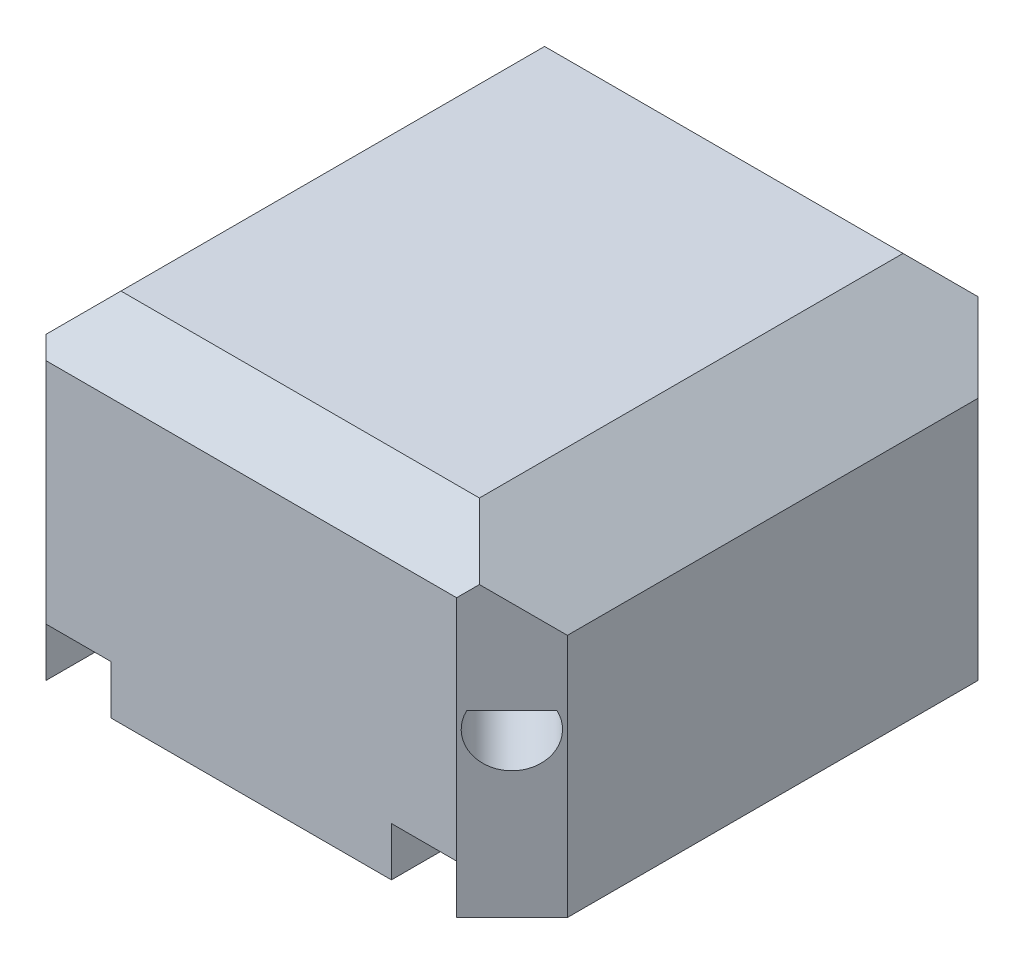
ISO-10303-21;
HEADER;
FILE_DESCRIPTION(('STEP AP214'),'2;1');
FILE_NAME('part.step','',(''),(''),'','','');
FILE_SCHEMA(('AUTOMOTIVE_DESIGN { 1 0 10303 214 1 1 1 1 }'));
ENDSEC;
DATA;
#1=APPLICATION_CONTEXT('core data for automotive mechanical design processes');
#2=APPLICATION_PROTOCOL_DEFINITION('international standard','automotive_design',2000,#1);
#3=PRODUCT_CONTEXT('',#1,'mechanical');
#4=PRODUCT('Part','Part','',(#3));
#5=PRODUCT_RELATED_PRODUCT_CATEGORY('part','',(#4));
#6=PRODUCT_DEFINITION_FORMATION('','',#4);
#7=PRODUCT_DEFINITION_CONTEXT('part definition',#1,'design');
#8=PRODUCT_DEFINITION('design','',#6,#7);
#9=PRODUCT_DEFINITION_SHAPE('','',#8);
#10=(LENGTH_UNIT() NAMED_UNIT(*) SI_UNIT(.MILLI.,.METRE.));
#11=(NAMED_UNIT(*) PLANE_ANGLE_UNIT() SI_UNIT($,.RADIAN.));
#12=(NAMED_UNIT(*) SI_UNIT($,.STERADIAN.) SOLID_ANGLE_UNIT());
#13=UNCERTAINTY_MEASURE_WITH_UNIT(LENGTH_MEASURE(1.E-05),#10,'distance_accuracy_value','');
#14=(GEOMETRIC_REPRESENTATION_CONTEXT(3) GLOBAL_UNCERTAINTY_ASSIGNED_CONTEXT((#13)) GLOBAL_UNIT_ASSIGNED_CONTEXT((#10,
#11,#12)) REPRESENTATION_CONTEXT('',''));
#15=CARTESIAN_POINT('',(0.,0.,0.));
#16=DIRECTION('',(0.,0.,1.));
#17=DIRECTION('',(1.,0.,0.));
#18=AXIS2_PLACEMENT_3D('',#15,#16,#17);
#19=CARTESIAN_POINT('',(-15.3430605110506,100.,66.928681339993));
#20=DIRECTION('',(-0.707106781186546,0.,-0.707106781186549));
#21=DIRECTION('',(0.,-1.,0.));
#22=AXIS2_PLACEMENT_3D('',#19,#20,#21);
#23=PLANE('',#22);
#24=DIRECTION('',(-0.577350269189627,0.577350269189625,0.577350269189625));
#25=VECTOR('',#24,1.);
#26=CARTESIAN_POINT('',(-9.70016673105307,69.3571062200024,61.2857875599954));
#27=LINE('',#26,#25);
#28=CARTESIAN_POINT('',(-28.8430605110507,88.4999999999999,80.428681339993));
#29=VERTEX_POINT('',#28);
#30=CARTESIAN_POINT('',(-15.3430605110506,75.,66.928681339993));
#31=VERTEX_POINT('',#30);
#32=EDGE_CURVE('E374',#29,#31,#27,.F.);
#33=ORIENTED_EDGE('',*,*,#32,.F.);
#34=DIRECTION('',(0.577350269189626,0.577350269189627,-0.577350269189624));
#35=VECTOR('',#34,1.);
#36=CARTESIAN_POINT('',(-16.0097271777173,101.333333333333,67.5953480066596));
#37=LINE('',#36,#35);
#38=CARTESIAN_POINT('',(-32.3430605110507,84.9999999999999,83.928681339993));
#39=VERTEX_POINT('',#38);
#40=EDGE_CURVE('E409',#29,#39,#37,.F.);
#41=ORIENTED_EDGE('',*,*,#40,.T.);
#42=DIRECTION('',(0.,1.,0.));
#43=VECTOR('',#42,1.);
#44=CARTESIAN_POINT('',(-32.3430605110507,100.,83.928681339993));
#45=LINE('',#44,#43);
#46=CARTESIAN_POINT('',(-32.3430605110507,15.,83.928681339993));
#47=VERTEX_POINT('',#46);
#48=EDGE_CURVE('E384',#47,#39,#45,.T.);
#49=ORIENTED_EDGE('',*,*,#48,.F.);
#50=CARTESIAN_POINT('',(-32.3430605110507,0.,83.928681339993));
#51=VERTEX_POINT('',#50);
#52=EDGE_CURVE('E381',#51,#47,#45,.T.);
#53=ORIENTED_EDGE('',*,*,#52,.F.);
#54=DIRECTION('',(0.707106781186549,0.,-0.707106781186546));
#55=VECTOR('',#54,1.);
#56=CARTESIAN_POINT('',(-15.3430605110506,0.,66.928681339993));
#57=LINE('',#56,#55);
#58=CARTESIAN_POINT('',(-15.3430605110506,0.,66.928681339993));
#59=VERTEX_POINT('',#58);
#60=EDGE_CURVE('E362',#59,#51,#57,.F.);
#61=ORIENTED_EDGE('',*,*,#60,.F.);
#62=DIRECTION('',(0.,-1.,0.));
#63=VECTOR('',#62,1.);
#64=CARTESIAN_POINT('',(-15.3430605110506,100.,66.928681339993));
#65=LINE('',#64,#63);
#66=EDGE_CURVE('E369',#31,#59,#65,.T.);
#67=ORIENTED_EDGE('',*,*,#66,.F.);
#68=EDGE_LOOP('',(#33,#41,#49,#53,#61,#67));
#69=FACE_BOUND('',#68,.T.);
#70=DIRECTION('',(0.707106781186547,0.,-0.707106781186548));
#71=VECTOR('',#70,1.);
#72=CARTESIAN_POINT('',(21.8641290744781,55.,29.7214917544641));
#73=LINE('',#72,#71);
#74=CARTESIAN_POINT('',(-30.7925925195198,55.,82.3782133484621));
#75=VERTEX_POINT('',#74);
#76=CARTESIAN_POINT('',(-16.9361860589688,55.,68.5218068879111));
#77=VERTEX_POINT('',#76);
#78=EDGE_CURVE('E245',#75,#77,#73,.T.);
#79=ORIENTED_EDGE('',*,*,#78,.T.);
#80=CARTESIAN_POINT('',(-23.8643892892443,50.,75.4500101181866));
#81=DIRECTION('',(-0.707106781186548,0.,-0.707106781186547));
#82=DIRECTION('',(-0.707106781186547,0.,0.707106781186548));
#83=AXIS2_PLACEMENT_3D('',#80,#81,#82);
#84=CIRCLE('',#83,11.);
#85=EDGE_CURVE('E70',#77,#75,#84,.T.);
#86=ORIENTED_EDGE('',*,*,#85,.T.);
#87=EDGE_LOOP('',(#79,#86));
#88=FACE_BOUND('',#87,.T.);
#89=ADVANCED_FACE('F43',(#69,#88),#23,.F.);
#90=CARTESIAN_POINT('',(-175.343060511051,100.,-59.071318660007));
#91=DIRECTION('',(0.707106781186546,0.,0.707106781186549));
#92=DIRECTION('',(0.,-1.,0.));
#93=AXIS2_PLACEMENT_3D('',#90,#91,#92);
#94=PLANE('',#93);
#95=DIRECTION('',(0.577350269189627,0.577350269189626,-0.577350269189625));
#96=VECTOR('',#95,1.);
#97=CARTESIAN_POINT('',(-178.36683339772,71.976227113331,-56.0475457733381));
#98=LINE('',#97,#96);
#99=CARTESIAN_POINT('',(-161.843060511051,88.4999999999999,-72.571318660007));
#100=VERTEX_POINT('',#99);
#101=CARTESIAN_POINT('',(-175.343060511051,75.,-59.071318660007));
#102=VERTEX_POINT('',#101);
#103=EDGE_CURVE('E394',#100,#102,#98,.F.);
#104=ORIENTED_EDGE('',*,*,#103,.F.);
#105=DIRECTION('',(-0.577350269189626,0.577350269189627,0.577350269189625));
#106=VECTOR('',#105,1.);
#107=CARTESIAN_POINT('',(-174.676393844384,101.333333333333,-59.7379853266737));
#108=LINE('',#107,#106);
#109=CARTESIAN_POINT('',(-158.343060511051,84.9999999999999,-76.071318660007));
#110=VERTEX_POINT('',#109);
#111=EDGE_CURVE('E420',#100,#110,#108,.F.);
#112=ORIENTED_EDGE('',*,*,#111,.T.);
#113=DIRECTION('',(0.,1.,0.));
#114=VECTOR('',#113,1.);
#115=CARTESIAN_POINT('',(-158.343060511051,100.,-76.071318660007));
#116=LINE('',#115,#114);
#117=CARTESIAN_POINT('',(-158.343060511051,15.,-76.071318660007));
#118=VERTEX_POINT('',#117);
#119=EDGE_CURVE('E351',#118,#110,#116,.T.);
#120=ORIENTED_EDGE('',*,*,#119,.F.);
#121=CARTESIAN_POINT('',(-158.343060511051,0.,-76.071318660007));
#122=VERTEX_POINT('',#121);
#123=EDGE_CURVE('E353',#122,#118,#116,.T.);
#124=ORIENTED_EDGE('',*,*,#123,.F.);
#125=DIRECTION('',(-0.707106781186549,0.,0.707106781186546));
#126=VECTOR('',#125,1.);
#127=CARTESIAN_POINT('',(-175.343060511051,0.,-59.071318660007));
#128=LINE('',#127,#126);
#129=CARTESIAN_POINT('',(-175.343060511051,0.,-59.071318660007));
#130=VERTEX_POINT('',#129);
#131=EDGE_CURVE('E365',#130,#122,#128,.F.);
#132=ORIENTED_EDGE('',*,*,#131,.F.);
#133=DIRECTION('',(0.,-1.,0.));
#134=VECTOR('',#133,1.);
#135=CARTESIAN_POINT('',(-175.343060511051,100.,-59.071318660007));
#136=LINE('',#135,#134);
#137=EDGE_CURVE('E390',#102,#130,#136,.T.);
#138=ORIENTED_EDGE('',*,*,#137,.F.);
#139=EDGE_LOOP('',(#104,#112,#120,#124,#132,#138));
#140=FACE_BOUND('',#139,.T.);
#141=DIRECTION('',(-0.707106781186547,0.,0.707106781186548));
#142=VECTOR('',#141,1.);
#143=CARTESIAN_POINT('',(-212.550250096579,55.,-21.8641290744781));
#144=LINE('',#143,#142);
#145=CARTESIAN_POINT('',(-159.893528502582,55.,-74.5208506684761));
#146=VERTEX_POINT('',#145);
#147=CARTESIAN_POINT('',(-173.749934963133,55.,-60.6644442079252));
#148=VERTEX_POINT('',#147);
#149=EDGE_CURVE('E259',#146,#148,#144,.T.);
#150=ORIENTED_EDGE('',*,*,#149,.T.);
#151=CARTESIAN_POINT('',(-166.821731732857,50.,-67.5926474382006));
#152=DIRECTION('',(0.707106781186548,0.,0.707106781186547));
#153=DIRECTION('',(0.707106781186547,0.,-0.707106781186548));
#154=AXIS2_PLACEMENT_3D('',#151,#152,#153);
#155=CIRCLE('',#154,11.);
#156=EDGE_CURVE('E249',#148,#146,#155,.T.);
#157=ORIENTED_EDGE('',*,*,#156,.T.);
#158=EDGE_LOOP('',(#150,#157));
#159=FACE_BOUND('',#158,.T.);
#160=ADVANCED_FACE('F499',(#140,#159),#94,.F.);
#161=CARTESIAN_POINT('',(-175.343060511051,100.,83.928681339993));
#162=DIRECTION('',(0.,0.,-1.));
#163=DIRECTION('',(-1.,0.,0.));
#164=AXIS2_PLACEMENT_3D('',#161,#162,#163);
#165=PLANE('',#164);
#166=DIRECTION('',(-1.,0.,0.));
#167=VECTOR('',#166,1.);
#168=CARTESIAN_POINT('',(-158.343060511051,15.,83.928681339993));
#169=LINE('',#168,#167);
#170=CARTESIAN_POINT('',(-138.343060511051,15.,83.928681339993));
#171=VERTEX_POINT('',#170);
#172=CARTESIAN_POINT('',(-158.343060511051,15.,83.928681339993));
#173=VERTEX_POINT('',#172);
#174=EDGE_CURVE('E278',#171,#173,#169,.T.);
#175=ORIENTED_EDGE('',*,*,#174,.F.);
#176=DIRECTION('',(0.,-1.,0.));
#177=VECTOR('',#176,1.);
#178=CARTESIAN_POINT('',(-138.343060511051,15.,83.928681339993));
#179=LINE('',#178,#177);
#180=CARTESIAN_POINT('',(-138.343060511051,0.,83.928681339993));
#181=VERTEX_POINT('',#180);
#182=EDGE_CURVE('E288',#171,#181,#179,.T.);
#183=ORIENTED_EDGE('',*,*,#182,.T.);
#184=DIRECTION('',(1.,0.,0.));
#185=VECTOR('',#184,1.);
#186=CARTESIAN_POINT('',(-175.343060511051,0.,83.928681339993));
#187=LINE('',#186,#185);
#188=CARTESIAN_POINT('',(-52.3430605110506,0.,83.928681339993));
#189=VERTEX_POINT('',#188);
#190=EDGE_CURVE('E334',#181,#189,#187,.T.);
#191=ORIENTED_EDGE('',*,*,#190,.T.);
#192=DIRECTION('',(0.,-1.,0.));
#193=VECTOR('',#192,1.);
#194=CARTESIAN_POINT('',(-52.3430605110507,15.,83.928681339993));
#195=LINE('',#194,#193);
#196=CARTESIAN_POINT('',(-52.3430605110507,15.,83.928681339993));
#197=VERTEX_POINT('',#196);
#198=EDGE_CURVE('E295',#197,#189,#195,.T.);
#199=ORIENTED_EDGE('',*,*,#198,.F.);
#200=DIRECTION('',(-1.,0.,0.));
#201=VECTOR('',#200,1.);
#202=CARTESIAN_POINT('',(-32.3430605110507,15.,83.928681339993));
#203=LINE('',#202,#201);
#204=EDGE_CURVE('E309',#47,#197,#203,.T.);
#205=ORIENTED_EDGE('',*,*,#204,.F.);
#206=ORIENTED_EDGE('',*,*,#48,.T.);
#207=DIRECTION('',(-1.,0.,0.));
#208=VECTOR('',#207,1.);
#209=CARTESIAN_POINT('',(-150.343060511051,84.9999999999999,83.928681339993));
#210=LINE('',#209,#208);
#211=CARTESIAN_POINT('',(-158.343060511051,84.9999999999999,83.928681339993));
#212=VERTEX_POINT('',#211);
#213=EDGE_CURVE('E408',#39,#212,#210,.T.);
#214=ORIENTED_EDGE('',*,*,#213,.T.);
#215=DIRECTION('',(0.,-1.,0.));
#216=VECTOR('',#215,1.);
#217=CARTESIAN_POINT('',(-158.343060511051,100.,83.928681339993));
#218=LINE('',#217,#216);
#219=EDGE_CURVE('E379',#212,#173,#218,.T.);
#220=ORIENTED_EDGE('',*,*,#219,.T.);
#221=EDGE_LOOP('',(#175,#183,#191,#199,#205,#206,#214,#220));
#222=FACE_BOUND('',#221,.T.);
#223=ADVANCED_FACE('F476',(#222),#165,.F.);
#224=CARTESIAN_POINT('',(-175.343060511051,100.,-76.071318660007));
#225=DIRECTION('',(0.,0.,1.));
#226=DIRECTION('',(1.,0.,0.));
#227=AXIS2_PLACEMENT_3D('',#224,#225,#226);
#228=PLANE('',#227);
#229=DIRECTION('',(1.,0.,0.));
#230=VECTOR('',#229,1.);
#231=CARTESIAN_POINT('',(-158.343060511051,15.,-76.071318660007));
#232=LINE('',#231,#230);
#233=CARTESIAN_POINT('',(-138.343060511051,15.,-76.071318660007));
#234=VERTEX_POINT('',#233);
#235=EDGE_CURVE('E275',#118,#234,#232,.T.);
#236=ORIENTED_EDGE('',*,*,#235,.F.);
#237=ORIENTED_EDGE('',*,*,#119,.T.);
#238=DIRECTION('',(1.,0.,0.));
#239=VECTOR('',#238,1.);
#240=CARTESIAN_POINT('',(-40.3430605110508,84.9999999999999,-76.071318660007));
#241=LINE('',#240,#239);
#242=CARTESIAN_POINT('',(-32.3430605110507,84.9999999999999,-76.071318660007));
#243=VERTEX_POINT('',#242);
#244=EDGE_CURVE('E55',#110,#243,#241,.T.);
#245=ORIENTED_EDGE('',*,*,#244,.T.);
#246=DIRECTION('',(0.,-1.,0.));
#247=VECTOR('',#246,1.);
#248=CARTESIAN_POINT('',(-32.3430605110507,100.,-76.071318660007));
#249=LINE('',#248,#247);
#250=CARTESIAN_POINT('',(-32.3430605110506,15.,-76.071318660007));
#251=VERTEX_POINT('',#250);
#252=EDGE_CURVE('E357',#243,#251,#249,.T.);
#253=ORIENTED_EDGE('',*,*,#252,.T.);
#254=DIRECTION('',(1.,0.,0.));
#255=VECTOR('',#254,1.);
#256=CARTESIAN_POINT('',(-32.3430605110506,15.,-76.071318660007));
#257=LINE('',#256,#255);
#258=CARTESIAN_POINT('',(-52.3430605110506,15.,-76.071318660007));
#259=VERTEX_POINT('',#258);
#260=EDGE_CURVE('E298',#259,#251,#257,.T.);
#261=ORIENTED_EDGE('',*,*,#260,.F.);
#262=DIRECTION('',(0.,-1.,0.));
#263=VECTOR('',#262,1.);
#264=CARTESIAN_POINT('',(-52.3430605110506,15.,-76.071318660007));
#265=LINE('',#264,#263);
#266=CARTESIAN_POINT('',(-52.3430605110506,0.,-76.071318660007));
#267=VERTEX_POINT('',#266);
#268=EDGE_CURVE('E300',#259,#267,#265,.T.);
#269=ORIENTED_EDGE('',*,*,#268,.T.);
#270=DIRECTION('',(-1.,0.,0.));
#271=VECTOR('',#270,1.);
#272=CARTESIAN_POINT('',(-175.343060511051,0.,-76.071318660007));
#273=LINE('',#272,#271);
#274=CARTESIAN_POINT('',(-138.343060511051,0.,-76.071318660007));
#275=VERTEX_POINT('',#274);
#276=EDGE_CURVE('E339',#267,#275,#273,.T.);
#277=ORIENTED_EDGE('',*,*,#276,.T.);
#278=DIRECTION('',(0.,-1.,0.));
#279=VECTOR('',#278,1.);
#280=CARTESIAN_POINT('',(-138.343060511051,15.,-76.071318660007));
#281=LINE('',#280,#279);
#282=EDGE_CURVE('E285',#234,#275,#281,.T.);
#283=ORIENTED_EDGE('',*,*,#282,.F.);
#284=EDGE_LOOP('',(#236,#237,#245,#253,#261,#269,#277,#283));
#285=FACE_BOUND('',#284,.T.);
#286=ADVANCED_FACE('F421',(#285),#228,.F.);
#287=CARTESIAN_POINT('',(0.,0.,0.));
#288=DIRECTION('',(0.,1.,0.));
#289=DIRECTION('',(0.,0.,1.));
#290=AXIS2_PLACEMENT_3D('',#287,#288,#289);
#291=PLANE('',#290);
#292=DIRECTION('',(0.,0.,-1.));
#293=VECTOR('',#292,1.);
#294=CARTESIAN_POINT('',(-158.343060511051,0.,83.928681339993));
#295=LINE('',#294,#293);
#296=CARTESIAN_POINT('',(-158.343060511051,0.,83.928681339993));
#297=VERTEX_POINT('',#296);
#298=EDGE_CURVE('E283',#297,#122,#295,.T.);
#299=ORIENTED_EDGE('',*,*,#298,.F.);
#300=DIRECTION('',(0.707106781186546,0.,0.707106781186549));
#301=VECTOR('',#300,1.);
#302=CARTESIAN_POINT('',(-158.343060511051,0.,83.928681339993));
#303=LINE('',#302,#301);
#304=CARTESIAN_POINT('',(-175.343060511051,0.,66.9286813399929));
#305=VERTEX_POINT('',#304);
#306=EDGE_CURVE('E359',#297,#305,#303,.F.);
#307=ORIENTED_EDGE('',*,*,#306,.T.);
#308=DIRECTION('',(0.,0.,1.));
#309=VECTOR('',#308,1.);
#310=CARTESIAN_POINT('',(-175.343060511051,0.,-76.071318660007));
#311=LINE('',#310,#309);
#312=EDGE_CURVE('E328',#130,#305,#311,.T.);
#313=ORIENTED_EDGE('',*,*,#312,.F.);
#314=ORIENTED_EDGE('',*,*,#131,.T.);
#315=EDGE_LOOP('',(#299,#307,#313,#314));
#316=FACE_BOUND('',#315,.T.);
#317=ADVANCED_FACE('F494',(#316),#291,.F.);
#318=DIRECTION('',(0.,0.,1.));
#319=VECTOR('',#318,1.);
#320=CARTESIAN_POINT('',(-138.343060511051,0.,83.928681339993));
#321=LINE('',#320,#319);
#322=EDGE_CURVE('E271',#275,#181,#321,.T.);
#323=ORIENTED_EDGE('',*,*,#322,.F.);
#324=ORIENTED_EDGE('',*,*,#276,.F.);
#325=DIRECTION('',(0.,0.,-1.));
#326=VECTOR('',#325,1.);
#327=CARTESIAN_POINT('',(-52.3430605110507,0.,83.928681339993));
#328=LINE('',#327,#326);
#329=EDGE_CURVE('E301',#189,#267,#328,.T.);
#330=ORIENTED_EDGE('',*,*,#329,.F.);
#331=ORIENTED_EDGE('',*,*,#190,.F.);
#332=EDGE_LOOP('',(#323,#324,#330,#331));
#333=FACE_BOUND('',#332,.T.);
#334=ADVANCED_FACE('F473',(#333),#291,.F.);
#335=DIRECTION('',(0.,0.,1.));
#336=VECTOR('',#335,1.);
#337=CARTESIAN_POINT('',(-32.3430605110507,0.,83.928681339993));
#338=LINE('',#337,#336);
#339=CARTESIAN_POINT('',(-32.3430605110506,0.,-76.071318660007));
#340=VERTEX_POINT('',#339);
#341=EDGE_CURVE('E281',#340,#51,#338,.T.);
#342=ORIENTED_EDGE('',*,*,#341,.F.);
#343=DIRECTION('',(-0.707106781186547,0.,-0.707106781186548));
#344=VECTOR('',#343,1.);
#345=CARTESIAN_POINT('',(-32.3430605110507,0.,-76.071318660007));
#346=LINE('',#345,#344);
#347=CARTESIAN_POINT('',(-15.3430605110507,0.,-59.071318660007));
#348=VERTEX_POINT('',#347);
#349=EDGE_CURVE('E368',#340,#348,#346,.F.);
#350=ORIENTED_EDGE('',*,*,#349,.T.);
#351=DIRECTION('',(0.,0.,-1.));
#352=VECTOR('',#351,1.);
#353=CARTESIAN_POINT('',(-15.3430605110507,0.,-76.071318660007));
#354=LINE('',#353,#352);
#355=EDGE_CURVE('E337',#59,#348,#354,.T.);
#356=ORIENTED_EDGE('',*,*,#355,.F.);
#357=ORIENTED_EDGE('',*,*,#60,.T.);
#358=EDGE_LOOP('',(#342,#350,#356,#357));
#359=FACE_BOUND('',#358,.T.);
#360=ADVANCED_FACE('F465',(#359),#291,.F.);
#361=CARTESIAN_POINT('',(-175.343060511051,100.,-76.071318660007));
#362=DIRECTION('',(1.,0.,0.));
#363=DIRECTION('',(0.,0.,-1.));
#364=AXIS2_PLACEMENT_3D('',#361,#362,#363);
#365=PLANE('',#364);
#366=DIRECTION('',(0.,0.,-1.));
#367=VECTOR('',#366,1.);
#368=CARTESIAN_POINT('',(-175.343060511051,75.,-76.071318660007));
#369=LINE('',#368,#367);
#370=CARTESIAN_POINT('',(-175.343060511051,75.,66.9286813399929));
#371=VERTEX_POINT('',#370);
#372=EDGE_CURVE('E348',#371,#102,#369,.T.);
#373=ORIENTED_EDGE('',*,*,#372,.T.);
#374=ORIENTED_EDGE('',*,*,#137,.T.);
#375=ORIENTED_EDGE('',*,*,#312,.T.);
#376=DIRECTION('',(0.,1.,0.));
#377=VECTOR('',#376,1.);
#378=CARTESIAN_POINT('',(-175.343060511051,100.,66.9286813399929));
#379=LINE('',#378,#377);
#380=EDGE_CURVE('E389',#305,#371,#379,.T.);
#381=ORIENTED_EDGE('',*,*,#380,.T.);
#382=EDGE_LOOP('',(#373,#374,#375,#381));
#383=FACE_BOUND('',#382,.T.);
#384=ADVANCED_FACE('F568',(#383),#365,.F.);
#385=CARTESIAN_POINT('',(-15.3430605110507,100.,-76.071318660007));
#386=DIRECTION('',(-1.,0.,0.));
#387=DIRECTION('',(0.,0.,1.));
#388=AXIS2_PLACEMENT_3D('',#385,#386,#387);
#389=PLANE('',#388);
#390=ORIENTED_EDGE('',*,*,#355,.T.);
#391=DIRECTION('',(0.,1.,0.));
#392=VECTOR('',#391,1.);
#393=CARTESIAN_POINT('',(-15.3430605110507,100.,-59.071318660007));
#394=LINE('',#393,#392);
#395=CARTESIAN_POINT('',(-15.3430605110507,75.,-59.071318660007));
#396=VERTEX_POINT('',#395);
#397=EDGE_CURVE('E373',#348,#396,#394,.T.);
#398=ORIENTED_EDGE('',*,*,#397,.T.);
#399=DIRECTION('',(0.,0.,1.));
#400=VECTOR('',#399,1.);
#401=CARTESIAN_POINT('',(-15.3430605110506,75.,83.928681339993));
#402=LINE('',#401,#400);
#403=EDGE_CURVE('E352',#396,#31,#402,.T.);
#404=ORIENTED_EDGE('',*,*,#403,.T.);
#405=ORIENTED_EDGE('',*,*,#66,.T.);
#406=EDGE_LOOP('',(#390,#398,#404,#405));
#407=FACE_BOUND('',#406,.T.);
#408=ADVANCED_FACE('F458',(#407),#389,.F.);
#409=CARTESIAN_POINT('',(0.,100.,0.));
#410=DIRECTION('',(0.,1.,0.));
#411=DIRECTION('',(0.,0.,1.));
#412=AXIS2_PLACEMENT_3D('',#409,#410,#411);
#413=PLANE('',#412);
#414=DIRECTION('',(0.,0.,1.));
#415=VECTOR('',#414,1.);
#416=CARTESIAN_POINT('',(-150.343060511051,100.,83.928681339993));
#417=LINE('',#416,#415);
#418=CARTESIAN_POINT('',(-150.343060511051,100.,-61.071318660007));
#419=VERTEX_POINT('',#418);
#420=CARTESIAN_POINT('',(-150.343060511051,100.,68.9286813399929));
#421=VERTEX_POINT('',#420);
#422=EDGE_CURVE('E342',#419,#421,#417,.T.);
#423=ORIENTED_EDGE('',*,*,#422,.T.);
#424=DIRECTION('',(1.,0.,0.));
#425=VECTOR('',#424,1.);
#426=CARTESIAN_POINT('',(-40.3430605110507,100.,68.9286813399929));
#427=LINE('',#426,#425);
#428=CARTESIAN_POINT('',(-40.3430605110508,100.,68.9286813399929));
#429=VERTEX_POINT('',#428);
#430=EDGE_CURVE('E396',#421,#429,#427,.T.);
#431=ORIENTED_EDGE('',*,*,#430,.T.);
#432=DIRECTION('',(0.,0.,-1.));
#433=VECTOR('',#432,1.);
#434=CARTESIAN_POINT('',(-40.3430605110508,100.,-76.071318660007));
#435=LINE('',#434,#433);
#436=CARTESIAN_POINT('',(-40.3430605110508,100.,-61.071318660007));
#437=VERTEX_POINT('',#436);
#438=EDGE_CURVE('E341',#429,#437,#435,.T.);
#439=ORIENTED_EDGE('',*,*,#438,.T.);
#440=DIRECTION('',(-1.,0.,0.));
#441=VECTOR('',#440,1.);
#442=CARTESIAN_POINT('',(-150.343060511051,100.,-61.071318660007));
#443=LINE('',#442,#441);
#444=EDGE_CURVE('E397',#437,#419,#443,.T.);
#445=ORIENTED_EDGE('',*,*,#444,.T.);
#446=EDGE_LOOP('',(#423,#431,#439,#445));
#447=FACE_BOUND('',#446,.T.);
#448=ADVANCED_FACE('F441',(#447),#413,.T.);
#449=CARTESIAN_POINT('',(-150.343060511051,100.,0.));
#450=DIRECTION('',(-0.707106781186547,0.707106781186548,0.));
#451=DIRECTION('',(0.,0.,-1.));
#452=AXIS2_PLACEMENT_3D('',#449,#450,#451);
#453=PLANE('',#452);
#454=DIRECTION('',(-0.577350269189626,-0.577350269189624,-0.577350269189628));
#455=VECTOR('',#454,1.);
#456=CARTESIAN_POINT('',(-180.985954291048,69.3571062200023,61.2857875599952));
#457=LINE('',#456,#455);
#458=CARTESIAN_POINT('',(-161.843060511051,88.4999999999999,80.428681339993));
#459=VERTEX_POINT('',#458);
#460=EDGE_CURVE('E392',#371,#459,#457,.F.);
#461=ORIENTED_EDGE('',*,*,#460,.T.);
#462=DIRECTION('',(0.577350269189627,0.577350269189626,-0.577350269189624));
#463=VECTOR('',#462,1.);
#464=CARTESIAN_POINT('',(-127.36683339772,122.976227113331,45.9524542266621));
#465=LINE('',#464,#463);
#466=EDGE_CURVE('E411',#459,#421,#465,.T.);
#467=ORIENTED_EDGE('',*,*,#466,.T.);
#468=ORIENTED_EDGE('',*,*,#422,.F.);
#469=DIRECTION('',(-0.577350269189627,-0.577350269189626,-0.577350269189624));
#470=VECTOR('',#469,1.);
#471=CARTESIAN_POINT('',(-129.985954291048,120.357106220002,-40.7142124400048));
#472=LINE('',#471,#470);
#473=EDGE_CURVE('E413',#419,#100,#472,.T.);
#474=ORIENTED_EDGE('',*,*,#473,.T.);
#475=ORIENTED_EDGE('',*,*,#103,.T.);
#476=ORIENTED_EDGE('',*,*,#372,.F.);
#477=EDGE_LOOP('',(#461,#467,#468,#474,#475,#476));
#478=FACE_BOUND('',#477,.T.);
#479=ADVANCED_FACE('F503',(#478),#453,.T.);
#480=CARTESIAN_POINT('',(-40.3430605110508,100.,0.));
#481=DIRECTION('',(0.707106781186547,0.707106781186548,0.));
#482=DIRECTION('',(0.,0.,1.));
#483=AXIS2_PLACEMENT_3D('',#480,#481,#482);
#484=PLANE('',#483);
#485=ORIENTED_EDGE('',*,*,#438,.F.);
#486=DIRECTION('',(0.577350269189628,-0.577350269189626,0.577350269189624));
#487=VECTOR('',#486,1.);
#488=CARTESIAN_POINT('',(-63.3192876243817,122.976227113331,45.9524542266621));
#489=LINE('',#488,#487);
#490=EDGE_CURVE('E404',#429,#29,#489,.T.);
#491=ORIENTED_EDGE('',*,*,#490,.T.);
#492=ORIENTED_EDGE('',*,*,#32,.T.);
#493=ORIENTED_EDGE('',*,*,#403,.F.);
#494=DIRECTION('',(0.577350269189626,-0.577350269189624,0.577350269189627));
#495=VECTOR('',#494,1.);
#496=CARTESIAN_POINT('',(-12.3192876243816,71.976227113331,-56.0475457733379));
#497=LINE('',#496,#495);
#498=CARTESIAN_POINT('',(-28.8430605110507,88.4999999999999,-72.571318660007));
#499=VERTEX_POINT('',#498);
#500=EDGE_CURVE('E380',#396,#499,#497,.F.);
#501=ORIENTED_EDGE('',*,*,#500,.T.);
#502=DIRECTION('',(-0.577350269189627,0.577350269189626,0.577350269189624));
#503=VECTOR('',#502,1.);
#504=CARTESIAN_POINT('',(-60.7001667310531,120.357106220002,-40.7142124400048));
#505=LINE('',#504,#503);
#506=EDGE_CURVE('E405',#499,#437,#505,.T.);
#507=ORIENTED_EDGE('',*,*,#506,.T.);
#508=EDGE_LOOP('',(#485,#491,#492,#493,#501,#507));
#509=FACE_BOUND('',#508,.T.);
#510=ADVANCED_FACE('F438',(#509),#484,.T.);
#511=CARTESIAN_POINT('',(-32.3430605110507,100.,-76.071318660007));
#512=DIRECTION('',(-0.707106781186548,0.,0.707106781186547));
#513=DIRECTION('',(0.,-1.,0.));
#514=AXIS2_PLACEMENT_3D('',#511,#512,#513);
#515=PLANE('',#514);
#516=CARTESIAN_POINT('',(-23.8643892892443,50.,-67.5926474382006));
#517=DIRECTION('',(0.707106781186548,0.,-0.707106781186547));
#518=DIRECTION('',(-0.707106781186547,0.,-0.707106781186548));
#519=AXIS2_PLACEMENT_3D('',#516,#517,#518);
#520=CIRCLE('',#519,11.);
#521=CARTESIAN_POINT('',(-16.9361860589688,55.,-60.6644442079251));
#522=VERTEX_POINT('',#521);
#523=CARTESIAN_POINT('',(-30.7925925195197,55.,-74.5208506684761));
#524=VERTEX_POINT('',#523);
#525=EDGE_CURVE('E286',#522,#524,#520,.T.);
#526=ORIENTED_EDGE('',*,*,#525,.F.);
#527=DIRECTION('',(0.707106781186547,0.,0.707106781186548));
#528=VECTOR('',#527,1.);
#529=CARTESIAN_POINT('',(21.8641290744781,55.,-21.8641290744781));
#530=LINE('',#529,#528);
#531=EDGE_CURVE('E316',#524,#522,#530,.T.);
#532=ORIENTED_EDGE('',*,*,#531,.F.);
#533=EDGE_LOOP('',(#526,#532));
#534=FACE_BOUND('',#533,.T.);
#535=ORIENTED_EDGE('',*,*,#252,.F.);
#536=DIRECTION('',(-0.577350269189624,-0.577350269189628,-0.577350269189626));
#537=VECTOR('',#536,1.);
#538=CARTESIAN_POINT('',(-27.3430605110506,90.,-71.071318660007));
#539=LINE('',#538,#537);
#540=EDGE_CURVE('E11',#243,#499,#539,.F.);
#541=ORIENTED_EDGE('',*,*,#540,.T.);
#542=ORIENTED_EDGE('',*,*,#500,.F.);
#543=ORIENTED_EDGE('',*,*,#397,.F.);
#544=ORIENTED_EDGE('',*,*,#349,.F.);
#545=DIRECTION('',(0.,-1.,0.));
#546=VECTOR('',#545,1.);
#547=CARTESIAN_POINT('',(-32.3430605110506,15.,-76.071318660007));
#548=LINE('',#547,#546);
#549=EDGE_CURVE('E267',#251,#340,#548,.T.);
#550=ORIENTED_EDGE('',*,*,#549,.F.);
#551=EDGE_LOOP('',(#535,#541,#542,#543,#544,#550));
#552=FACE_BOUND('',#551,.T.);
#553=ADVANCED_FACE('F431',(#534,#552),#515,.F.);
#554=CARTESIAN_POINT('',(-158.343060511051,100.,83.928681339993));
#555=DIRECTION('',(0.707106781186549,0.,-0.707106781186546));
#556=DIRECTION('',(0.,-1.,0.));
#557=AXIS2_PLACEMENT_3D('',#554,#555,#556);
#558=PLANE('',#557);
#559=CARTESIAN_POINT('',(-166.821731732857,50.,75.4500101181866));
#560=DIRECTION('',(-0.707106781186548,0.,0.707106781186547));
#561=DIRECTION('',(0.707106781186547,0.,0.707106781186548));
#562=AXIS2_PLACEMENT_3D('',#559,#560,#561);
#563=CIRCLE('',#562,11.);
#564=CARTESIAN_POINT('',(-173.749934963132,55.,68.5218068879111));
#565=VERTEX_POINT('',#564);
#566=CARTESIAN_POINT('',(-159.893528502582,55.,82.3782133484621));
#567=VERTEX_POINT('',#566);
#568=EDGE_CURVE('E56',#565,#567,#563,.T.);
#569=ORIENTED_EDGE('',*,*,#568,.F.);
#570=DIRECTION('',(-0.707106781186547,0.,-0.707106781186548));
#571=VECTOR('',#570,1.);
#572=CARTESIAN_POINT('',(-212.550250096579,55.,29.7214917544641));
#573=LINE('',#572,#571);
#574=EDGE_CURVE('E229',#567,#565,#573,.T.);
#575=ORIENTED_EDGE('',*,*,#574,.F.);
#576=EDGE_LOOP('',(#569,#575));
#577=FACE_BOUND('',#576,.T.);
#578=ORIENTED_EDGE('',*,*,#219,.F.);
#579=DIRECTION('',(0.577350269189624,-0.577350269189628,0.577350269189626));
#580=VECTOR('',#579,1.);
#581=CARTESIAN_POINT('',(-163.343060511051,90.,78.9286813399929));
#582=LINE('',#581,#580);
#583=EDGE_CURVE('E412',#212,#459,#582,.F.);
#584=ORIENTED_EDGE('',*,*,#583,.T.);
#585=ORIENTED_EDGE('',*,*,#460,.F.);
#586=ORIENTED_EDGE('',*,*,#380,.F.);
#587=ORIENTED_EDGE('',*,*,#306,.F.);
#588=DIRECTION('',(0.,-1.,0.));
#589=VECTOR('',#588,1.);
#590=CARTESIAN_POINT('',(-158.343060511051,15.,83.928681339993));
#591=LINE('',#590,#589);
#592=EDGE_CURVE('E290',#173,#297,#591,.T.);
#593=ORIENTED_EDGE('',*,*,#592,.F.);
#594=EDGE_LOOP('',(#578,#584,#585,#586,#587,#593));
#595=FACE_BOUND('',#594,.T.);
#596=ADVANCED_FACE('F486',(#577,#595),#558,.F.);
#597=CARTESIAN_POINT('',(0.,100.,68.9286813399929));
#598=DIRECTION('',(0.,0.707106781186546,0.707106781186549));
#599=DIRECTION('',(-1.,0.,0.));
#600=AXIS2_PLACEMENT_3D('',#597,#598,#599);
#601=PLANE('',#600);
#602=ORIENTED_EDGE('',*,*,#583,.F.);
#603=ORIENTED_EDGE('',*,*,#213,.F.);
#604=ORIENTED_EDGE('',*,*,#40,.F.);
#605=ORIENTED_EDGE('',*,*,#490,.F.);
#606=ORIENTED_EDGE('',*,*,#430,.F.);
#607=ORIENTED_EDGE('',*,*,#466,.F.);
#608=EDGE_LOOP('',(#602,#603,#604,#605,#606,#607));
#609=FACE_BOUND('',#608,.T.);
#610=ADVANCED_FACE('F450',(#609),#601,.T.);
#611=CARTESIAN_POINT('',(0.,100.,-61.071318660007));
#612=DIRECTION('',(0.,0.707106781186546,-0.707106781186549));
#613=DIRECTION('',(1.,0.,0.));
#614=AXIS2_PLACEMENT_3D('',#611,#612,#613);
#615=PLANE('',#614);
#616=ORIENTED_EDGE('',*,*,#540,.F.);
#617=ORIENTED_EDGE('',*,*,#244,.F.);
#618=ORIENTED_EDGE('',*,*,#111,.F.);
#619=ORIENTED_EDGE('',*,*,#473,.F.);
#620=ORIENTED_EDGE('',*,*,#444,.F.);
#621=ORIENTED_EDGE('',*,*,#506,.F.);
#622=EDGE_LOOP('',(#616,#617,#618,#619,#620,#621));
#623=FACE_BOUND('',#622,.T.);
#624=ADVANCED_FACE('F46',(#623),#615,.T.);
#625=CARTESIAN_POINT('',(-59.2197283485717,50.,-32.2373083788732));
#626=DIRECTION('',(0.707106781186548,0.,-0.707106781186547));
#627=DIRECTION('',(-0.707106781186547,0.,-0.707106781186548));
#628=AXIS2_PLACEMENT_3D('',#625,#626,#627);
#629=CYLINDRICAL_SURFACE('',#628,11.);
#630=ORIENTED_EDGE('',*,*,#525,.T.);
#631=DIRECTION('',(0.707106781186548,0.,-0.707106781186547));
#632=VECTOR('',#631,1.);
#633=CARTESIAN_POINT('',(-66.1479315788472,55.,-39.1655116091488));
#634=LINE('',#633,#632);
#635=CARTESIAN_POINT('',(-66.1479315788472,55.,-39.1655116091488));
#636=VERTEX_POINT('',#635);
#637=EDGE_CURVE('E321',#636,#524,#634,.T.);
#638=ORIENTED_EDGE('',*,*,#637,.F.);
#639=CARTESIAN_POINT('',(-59.2197283485717,50.,-32.2373083788732));
#640=DIRECTION('',(0.707106781186548,0.,-0.707106781186547));
#641=DIRECTION('',(-0.707106781186547,0.,-0.707106781186548));
#642=AXIS2_PLACEMENT_3D('',#639,#640,#641);
#643=CIRCLE('',#642,11.);
#644=CARTESIAN_POINT('',(-52.2915251182962,55.,-25.3091051485977));
#645=VERTEX_POINT('',#644);
#646=EDGE_CURVE('E314',#645,#636,#643,.T.);
#647=ORIENTED_EDGE('',*,*,#646,.F.);
#648=DIRECTION('',(0.707106781186548,0.,-0.707106781186547));
#649=VECTOR('',#648,1.);
#650=CARTESIAN_POINT('',(-52.2915251182962,55.,-25.3091051485977));
#651=LINE('',#650,#649);
#652=EDGE_CURVE('E327',#645,#522,#651,.T.);
#653=ORIENTED_EDGE('',*,*,#652,.T.);
#654=EDGE_LOOP('',(#630,#638,#647,#653));
#655=FACE_BOUND('',#654,.T.);
#656=ADVANCED_FACE('F547',(#655),#629,.F.);
#657=CARTESIAN_POINT('',(-13.4912099848493,55.,13.4912099848492));
#658=DIRECTION('',(0.,1.,0.));
#659=DIRECTION('',(0.,0.,1.));
#660=AXIS2_PLACEMENT_3D('',#657,#658,#659);
#661=PLANE('',#660);
#662=ORIENTED_EDGE('',*,*,#531,.T.);
#663=ORIENTED_EDGE('',*,*,#652,.F.);
#664=DIRECTION('',(0.707106781186547,0.,0.707106781186548));
#665=VECTOR('',#664,1.);
#666=CARTESIAN_POINT('',(-13.4912099848493,55.,13.4912099848492));
#667=LINE('',#666,#665);
#668=EDGE_CURVE('E319',#636,#645,#667,.T.);
#669=ORIENTED_EDGE('',*,*,#668,.F.);
#670=ORIENTED_EDGE('',*,*,#637,.T.);
#671=EDGE_LOOP('',(#662,#663,#669,#670));
#672=FACE_BOUND('',#671,.T.);
#673=ADVANCED_FACE('F548',(#672),#661,.F.);
#674=CARTESIAN_POINT('',(-13.4912099848493,0.,13.4912099848492));
#675=DIRECTION('',(0.707106781186548,0.,-0.707106781186547));
#676=DIRECTION('',(-0.707106781186547,0.,-0.707106781186548));
#677=AXIS2_PLACEMENT_3D('',#674,#675,#676);
#678=PLANE('',#677);
#679=ORIENTED_EDGE('',*,*,#646,.T.);
#680=ORIENTED_EDGE('',*,*,#668,.T.);
#681=EDGE_LOOP('',(#679,#680));
#682=FACE_BOUND('',#681,.T.);
#683=ADVANCED_FACE('F511',(#682),#678,.T.);
#684=CARTESIAN_POINT('',(-32.3430605110507,15.,83.928681339993));
#685=DIRECTION('',(1.,0.,0.));
#686=DIRECTION('',(0.,0.,-1.));
#687=AXIS2_PLACEMENT_3D('',#684,#685,#686);
#688=PLANE('',#687);
#689=ORIENTED_EDGE('',*,*,#341,.T.);
#690=ORIENTED_EDGE('',*,*,#52,.T.);
#691=DIRECTION('',(0.,0.,1.));
#692=VECTOR('',#691,1.);
#693=CARTESIAN_POINT('',(-32.3430605110507,15.,83.928681339993));
#694=LINE('',#693,#692);
#695=EDGE_CURVE('E303',#251,#47,#694,.T.);
#696=ORIENTED_EDGE('',*,*,#695,.F.);
#697=ORIENTED_EDGE('',*,*,#549,.T.);
#698=EDGE_LOOP('',(#689,#690,#696,#697));
#699=FACE_BOUND('',#698,.T.);
#700=ADVANCED_FACE('F461',(#699),#688,.F.);
#701=CARTESIAN_POINT('',(-52.3430605110507,15.,83.928681339993));
#702=DIRECTION('',(-1.,0.,0.));
#703=DIRECTION('',(0.,0.,1.));
#704=AXIS2_PLACEMENT_3D('',#701,#702,#703);
#705=PLANE('',#704);
#706=ORIENTED_EDGE('',*,*,#329,.T.);
#707=ORIENTED_EDGE('',*,*,#268,.F.);
#708=DIRECTION('',(0.,0.,-1.));
#709=VECTOR('',#708,1.);
#710=CARTESIAN_POINT('',(-52.3430605110507,15.,83.928681339993));
#711=LINE('',#710,#709);
#712=EDGE_CURVE('E310',#197,#259,#711,.T.);
#713=ORIENTED_EDGE('',*,*,#712,.F.);
#714=ORIENTED_EDGE('',*,*,#198,.T.);
#715=EDGE_LOOP('',(#706,#707,#713,#714));
#716=FACE_BOUND('',#715,.T.);
#717=ADVANCED_FACE('F506',(#716),#705,.F.);
#718=CARTESIAN_POINT('',(0.,15.,0.));
#719=DIRECTION('',(0.,1.,0.));
#720=DIRECTION('',(0.,0.,1.));
#721=AXIS2_PLACEMENT_3D('',#718,#719,#720);
#722=PLANE('',#721);
#723=ORIENTED_EDGE('',*,*,#695,.T.);
#724=ORIENTED_EDGE('',*,*,#204,.T.);
#725=ORIENTED_EDGE('',*,*,#712,.T.);
#726=ORIENTED_EDGE('',*,*,#260,.T.);
#727=EDGE_LOOP('',(#723,#724,#725,#726));
#728=FACE_BOUND('',#727,.T.);
#729=ADVANCED_FACE('F470',(#728),#722,.F.);
#730=CARTESIAN_POINT('',(-158.343060511051,15.,83.928681339993));
#731=DIRECTION('',(-1.,0.,0.));
#732=DIRECTION('',(0.,0.,1.));
#733=AXIS2_PLACEMENT_3D('',#730,#731,#732);
#734=PLANE('',#733);
#735=ORIENTED_EDGE('',*,*,#298,.T.);
#736=ORIENTED_EDGE('',*,*,#123,.T.);
#737=DIRECTION('',(0.,0.,-1.));
#738=VECTOR('',#737,1.);
#739=CARTESIAN_POINT('',(-158.343060511051,15.,83.928681339993));
#740=LINE('',#739,#738);
#741=EDGE_CURVE('E266',#173,#118,#740,.T.);
#742=ORIENTED_EDGE('',*,*,#741,.F.);
#743=ORIENTED_EDGE('',*,*,#592,.T.);
#744=EDGE_LOOP('',(#735,#736,#742,#743));
#745=FACE_BOUND('',#744,.T.);
#746=ADVANCED_FACE('F495',(#745),#734,.F.);
#747=CARTESIAN_POINT('',(-138.343060511051,15.,83.928681339993));
#748=DIRECTION('',(1.,0.,0.));
#749=DIRECTION('',(0.,0.,-1.));
#750=AXIS2_PLACEMENT_3D('',#747,#748,#749);
#751=PLANE('',#750);
#752=ORIENTED_EDGE('',*,*,#322,.T.);
#753=ORIENTED_EDGE('',*,*,#182,.F.);
#754=DIRECTION('',(0.,0.,1.));
#755=VECTOR('',#754,1.);
#756=CARTESIAN_POINT('',(-138.343060511051,15.,83.928681339993));
#757=LINE('',#756,#755);
#758=EDGE_CURVE('E279',#234,#171,#757,.T.);
#759=ORIENTED_EDGE('',*,*,#758,.F.);
#760=ORIENTED_EDGE('',*,*,#282,.T.);
#761=EDGE_LOOP('',(#752,#753,#759,#760));
#762=FACE_BOUND('',#761,.T.);
#763=ADVANCED_FACE('F480',(#762),#751,.F.);
#764=CARTESIAN_POINT('',(0.,15.,0.));
#765=DIRECTION('',(0.,-1.,0.));
#766=DIRECTION('',(0.,0.,-1.));
#767=AXIS2_PLACEMENT_3D('',#764,#765,#766);
#768=PLANE('',#767);
#769=ORIENTED_EDGE('',*,*,#741,.T.);
#770=ORIENTED_EDGE('',*,*,#235,.T.);
#771=ORIENTED_EDGE('',*,*,#758,.T.);
#772=ORIENTED_EDGE('',*,*,#174,.T.);
#773=EDGE_LOOP('',(#769,#770,#771,#772));
#774=FACE_BOUND('',#773,.T.);
#775=ADVANCED_FACE('F483',(#774),#768,.T.);
#776=CARTESIAN_POINT('',(-131.46639267353,50.,-32.2373083788732));
#777=DIRECTION('',(-0.707106781186548,0.,-0.707106781186547));
#778=DIRECTION('',(-0.707106781186547,0.,0.707106781186548));
#779=AXIS2_PLACEMENT_3D('',#776,#777,#778);
#780=CYLINDRICAL_SURFACE('',#779,11.);
#781=ORIENTED_EDGE('',*,*,#156,.F.);
#782=DIRECTION('',(-0.707106781186548,0.,-0.707106781186547));
#783=VECTOR('',#782,1.);
#784=CARTESIAN_POINT('',(-138.394595903805,55.,-25.3091051485977));
#785=LINE('',#784,#783);
#786=CARTESIAN_POINT('',(-138.394595903805,55.,-25.3091051485977));
#787=VERTEX_POINT('',#786);
#788=EDGE_CURVE('E260',#787,#148,#785,.T.);
#789=ORIENTED_EDGE('',*,*,#788,.F.);
#790=CARTESIAN_POINT('',(-131.46639267353,50.,-32.2373083788732));
#791=DIRECTION('',(0.707106781186548,0.,0.707106781186547));
#792=DIRECTION('',(0.707106781186547,0.,-0.707106781186548));
#793=AXIS2_PLACEMENT_3D('',#790,#791,#792);
#794=CIRCLE('',#793,11.);
#795=CARTESIAN_POINT('',(-124.538189443254,55.,-39.1655116091487));
#796=VERTEX_POINT('',#795);
#797=EDGE_CURVE('E255',#787,#796,#794,.T.);
#798=ORIENTED_EDGE('',*,*,#797,.T.);
#799=DIRECTION('',(-0.707106781186548,0.,-0.707106781186547));
#800=VECTOR('',#799,1.);
#801=CARTESIAN_POINT('',(-124.538189443254,55.,-39.1655116091487));
#802=LINE('',#801,#800);
#803=EDGE_CURVE('E263',#796,#146,#802,.T.);
#804=ORIENTED_EDGE('',*,*,#803,.T.);
#805=EDGE_LOOP('',(#781,#789,#798,#804));
#806=FACE_BOUND('',#805,.T.);
#807=ADVANCED_FACE('F690',(#806),#780,.F.);
#808=CARTESIAN_POINT('',(-177.194911037252,55.,13.4912099848493));
#809=DIRECTION('',(0.,-1.,0.));
#810=DIRECTION('',(0.,0.,-1.));
#811=AXIS2_PLACEMENT_3D('',#808,#809,#810);
#812=PLANE('',#811);
#813=ORIENTED_EDGE('',*,*,#149,.F.);
#814=ORIENTED_EDGE('',*,*,#803,.F.);
#815=DIRECTION('',(-0.707106781186547,0.,0.707106781186548));
#816=VECTOR('',#815,1.);
#817=CARTESIAN_POINT('',(-177.194911037252,55.,13.4912099848493));
#818=LINE('',#817,#816);
#819=EDGE_CURVE('E253',#796,#787,#818,.T.);
#820=ORIENTED_EDGE('',*,*,#819,.T.);
#821=ORIENTED_EDGE('',*,*,#788,.T.);
#822=EDGE_LOOP('',(#813,#814,#820,#821));
#823=FACE_BOUND('',#822,.T.);
#824=ADVANCED_FACE('F691',(#823),#812,.T.);
#825=CARTESIAN_POINT('',(-177.194911037252,0.,13.4912099848493));
#826=DIRECTION('',(-0.707106781186548,0.,-0.707106781186547));
#827=DIRECTION('',(0.707106781186547,0.,-0.707106781186548));
#828=AXIS2_PLACEMENT_3D('',#825,#826,#827);
#829=PLANE('',#828);
#830=ORIENTED_EDGE('',*,*,#797,.F.);
#831=ORIENTED_EDGE('',*,*,#819,.F.);
#832=EDGE_LOOP('',(#830,#831));
#833=FACE_BOUND('',#832,.T.);
#834=ADVANCED_FACE('F701',(#833),#829,.T.);
#835=CARTESIAN_POINT('',(-59.2197283485717,50.,40.0946710588592));
#836=DIRECTION('',(0.707106781186548,0.,0.707106781186547));
#837=DIRECTION('',(0.707106781186547,0.,-0.707106781186548));
#838=AXIS2_PLACEMENT_3D('',#835,#836,#837);
#839=CYLINDRICAL_SURFACE('',#838,11.);
#840=ORIENTED_EDGE('',*,*,#85,.F.);
#841=DIRECTION('',(0.707106781186548,0.,0.707106781186547));
#842=VECTOR('',#841,1.);
#843=CARTESIAN_POINT('',(-52.2915251182962,55.,33.1664678285837));
#844=LINE('',#843,#842);
#845=CARTESIAN_POINT('',(-52.2915251182962,55.,33.1664678285837));
#846=VERTEX_POINT('',#845);
#847=EDGE_CURVE('E242',#846,#77,#844,.T.);
#848=ORIENTED_EDGE('',*,*,#847,.F.);
#849=CARTESIAN_POINT('',(-59.2197283485717,50.,40.0946710588592));
#850=DIRECTION('',(-0.707106781186548,0.,-0.707106781186547));
#851=DIRECTION('',(-0.707106781186547,0.,0.707106781186548));
#852=AXIS2_PLACEMENT_3D('',#849,#850,#851);
#853=CIRCLE('',#852,11.);
#854=CARTESIAN_POINT('',(-66.1479315788472,55.,47.0228742891347));
#855=VERTEX_POINT('',#854);
#856=EDGE_CURVE('E238',#846,#855,#853,.T.);
#857=ORIENTED_EDGE('',*,*,#856,.T.);
#858=DIRECTION('',(0.707106781186548,0.,0.707106781186547));
#859=VECTOR('',#858,1.);
#860=CARTESIAN_POINT('',(-66.1479315788472,55.,47.0228742891347));
#861=LINE('',#860,#859);
#862=EDGE_CURVE('E247',#855,#75,#861,.T.);
#863=ORIENTED_EDGE('',*,*,#862,.T.);
#864=EDGE_LOOP('',(#840,#848,#857,#863));
#865=FACE_BOUND('',#864,.T.);
#866=ADVANCED_FACE('F708',(#865),#839,.F.);
#867=CARTESIAN_POINT('',(-13.4912099848493,55.,-5.63384730486328));
#868=DIRECTION('',(0.,-1.,0.));
#869=DIRECTION('',(0.,0.,-1.));
#870=AXIS2_PLACEMENT_3D('',#867,#868,#869);
#871=PLANE('',#870);
#872=ORIENTED_EDGE('',*,*,#78,.F.);
#873=ORIENTED_EDGE('',*,*,#862,.F.);
#874=DIRECTION('',(0.707106781186547,0.,-0.707106781186548));
#875=VECTOR('',#874,1.);
#876=CARTESIAN_POINT('',(-13.4912099848493,55.,-5.63384730486328));
#877=LINE('',#876,#875);
#878=EDGE_CURVE('E241',#855,#846,#877,.T.);
#879=ORIENTED_EDGE('',*,*,#878,.T.);
#880=ORIENTED_EDGE('',*,*,#847,.T.);
#881=EDGE_LOOP('',(#872,#873,#879,#880));
#882=FACE_BOUND('',#881,.T.);
#883=ADVANCED_FACE('F719',(#882),#871,.T.);
#884=CARTESIAN_POINT('',(-13.4912099848493,0.,-5.63384730486328));
#885=DIRECTION('',(0.707106781186548,0.,0.707106781186547));
#886=DIRECTION('',(-0.707106781186547,0.,0.707106781186548));
#887=AXIS2_PLACEMENT_3D('',#884,#885,#886);
#888=PLANE('',#887);
#889=ORIENTED_EDGE('',*,*,#856,.F.);
#890=ORIENTED_EDGE('',*,*,#878,.F.);
#891=EDGE_LOOP('',(#889,#890));
#892=FACE_BOUND('',#891,.T.);
#893=ADVANCED_FACE('F730',(#892),#888,.T.);
#894=CARTESIAN_POINT('',(-131.46639267353,50.,40.0946710588592));
#895=DIRECTION('',(-0.707106781186548,0.,0.707106781186547));
#896=DIRECTION('',(0.707106781186547,0.,0.707106781186548));
#897=AXIS2_PLACEMENT_3D('',#894,#895,#896);
#898=CYLINDRICAL_SURFACE('',#897,11.);
#899=ORIENTED_EDGE('',*,*,#568,.T.);
#900=DIRECTION('',(-0.707106781186548,0.,0.707106781186547));
#901=VECTOR('',#900,1.);
#902=CARTESIAN_POINT('',(-124.538189443254,55.,47.0228742891347));
#903=LINE('',#902,#901);
#904=CARTESIAN_POINT('',(-124.538189443254,55.,47.0228742891347));
#905=VERTEX_POINT('',#904);
#906=EDGE_CURVE('E217',#905,#567,#903,.T.);
#907=ORIENTED_EDGE('',*,*,#906,.F.);
#908=CARTESIAN_POINT('',(-131.46639267353,50.,40.0946710588592));
#909=DIRECTION('',(-0.707106781186548,0.,0.707106781186547));
#910=DIRECTION('',(0.707106781186547,0.,0.707106781186548));
#911=AXIS2_PLACEMENT_3D('',#908,#909,#910);
#912=CIRCLE('',#911,11.);
#913=CARTESIAN_POINT('',(-138.394595903805,55.,33.1664678285837));
#914=VERTEX_POINT('',#913);
#915=EDGE_CURVE('E219',#914,#905,#912,.T.);
#916=ORIENTED_EDGE('',*,*,#915,.F.);
#917=DIRECTION('',(-0.707106781186548,0.,0.707106781186547));
#918=VECTOR('',#917,1.);
#919=CARTESIAN_POINT('',(-138.394595903805,55.,33.1664678285837));
#920=LINE('',#919,#918);
#921=EDGE_CURVE('E223',#914,#565,#920,.T.);
#922=ORIENTED_EDGE('',*,*,#921,.T.);
#923=EDGE_LOOP('',(#899,#907,#916,#922));
#924=FACE_BOUND('',#923,.T.);
#925=ADVANCED_FACE('F218',(#924),#898,.F.);
#926=CARTESIAN_POINT('',(-177.194911037252,55.,-5.63384730486326));
#927=DIRECTION('',(0.,1.,0.));
#928=DIRECTION('',(0.,0.,1.));
#929=AXIS2_PLACEMENT_3D('',#926,#927,#928);
#930=PLANE('',#929);
#931=ORIENTED_EDGE('',*,*,#574,.T.);
#932=ORIENTED_EDGE('',*,*,#921,.F.);
#933=DIRECTION('',(-0.707106781186547,0.,-0.707106781186548));
#934=VECTOR('',#933,1.);
#935=CARTESIAN_POINT('',(-177.194911037252,55.,-5.63384730486326));
#936=LINE('',#935,#934);
#937=EDGE_CURVE('E228',#905,#914,#936,.T.);
#938=ORIENTED_EDGE('',*,*,#937,.F.);
#939=ORIENTED_EDGE('',*,*,#906,.T.);
#940=EDGE_LOOP('',(#931,#932,#938,#939));
#941=FACE_BOUND('',#940,.T.);
#942=ADVANCED_FACE('F235',(#941),#930,.F.);
#943=CARTESIAN_POINT('',(-177.194911037252,0.,-5.63384730486326));
#944=DIRECTION('',(-0.707106781186548,0.,0.707106781186547));
#945=DIRECTION('',(0.707106781186547,0.,0.707106781186548));
#946=AXIS2_PLACEMENT_3D('',#943,#944,#945);
#947=PLANE('',#946);
#948=ORIENTED_EDGE('',*,*,#915,.T.);
#949=ORIENTED_EDGE('',*,*,#937,.T.);
#950=EDGE_LOOP('',(#948,#949));
#951=FACE_BOUND('',#950,.T.);
#952=ADVANCED_FACE('F230',(#951),#947,.T.);
#953=CLOSED_SHELL('',(#89,#160,#223,#286,#317,#334,#360,#384,#408,#448,#479,#510,#553,#596,#610,
#624,#656,#673,#683,#700,#717,#729,#746,#763,#775,#807,#824,#834,#866,#883,#893,#925,#942,#952));
#954=MANIFOLD_SOLID_BREP('B2',#953);
#955=ADVANCED_BREP_SHAPE_REPRESENTATION('',(#18,#954),#14);
#956=SHAPE_DEFINITION_REPRESENTATION(#9,#955);
ENDSEC;
END-ISO-10303-21;
